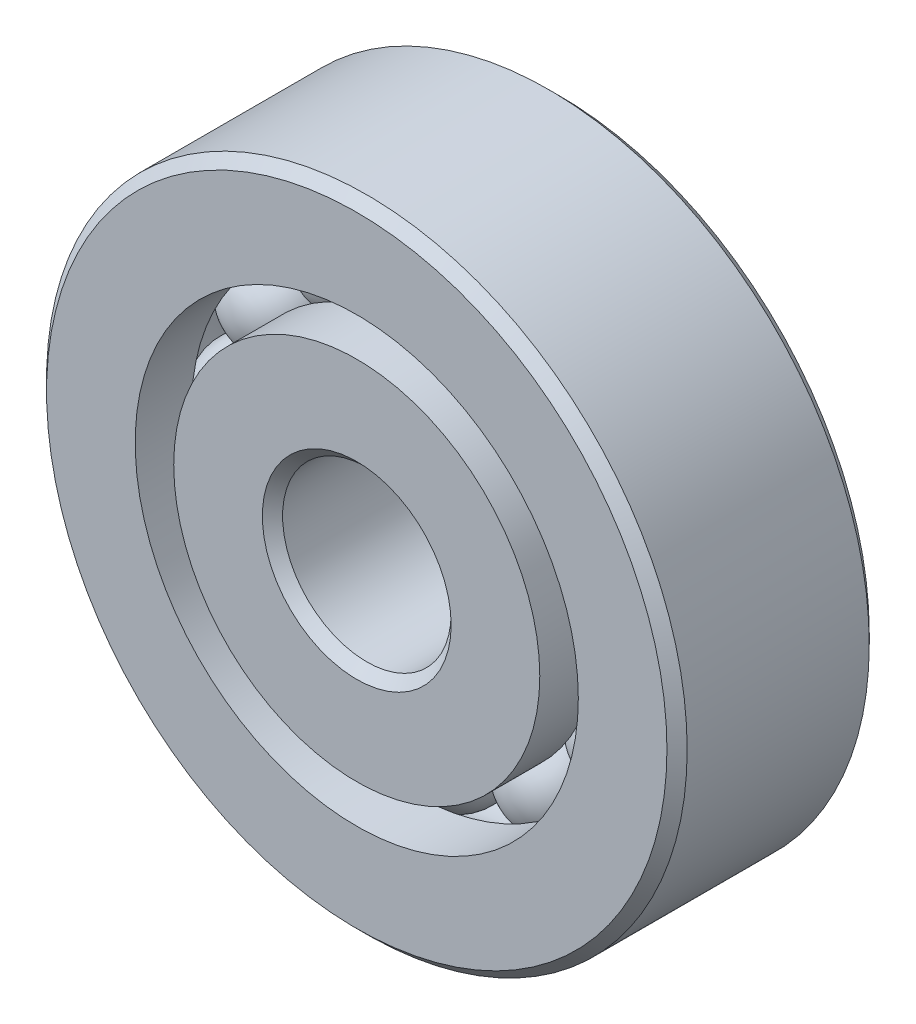
ISO-10303-21;
HEADER;
FILE_DESCRIPTION(('STEP AP214'),'2;1');
FILE_NAME('part.step','',(''),(''),'','','');
FILE_SCHEMA(('AUTOMOTIVE_DESIGN { 1 0 10303 214 1 1 1 1 }'));
ENDSEC;
DATA;
#1=APPLICATION_CONTEXT('core data for automotive mechanical design processes');
#2=APPLICATION_PROTOCOL_DEFINITION('international standard','automotive_design',2000,#1);
#3=PRODUCT_CONTEXT('',#1,'mechanical');
#4=PRODUCT('Part','Part','',(#3));
#5=PRODUCT_RELATED_PRODUCT_CATEGORY('part','',(#4));
#6=PRODUCT_DEFINITION_FORMATION('','',#4);
#7=PRODUCT_DEFINITION_CONTEXT('part definition',#1,'design');
#8=PRODUCT_DEFINITION('design','',#6,#7);
#9=PRODUCT_DEFINITION_SHAPE('','',#8);
#10=(LENGTH_UNIT() NAMED_UNIT(*) SI_UNIT(.MILLI.,.METRE.));
#11=(NAMED_UNIT(*) PLANE_ANGLE_UNIT() SI_UNIT($,.RADIAN.));
#12=(NAMED_UNIT(*) SI_UNIT($,.STERADIAN.) SOLID_ANGLE_UNIT());
#13=UNCERTAINTY_MEASURE_WITH_UNIT(LENGTH_MEASURE(1.E-05),#10,'distance_accuracy_value','');
#14=(GEOMETRIC_REPRESENTATION_CONTEXT(3) GLOBAL_UNCERTAINTY_ASSIGNED_CONTEXT((#13)) GLOBAL_UNIT_ASSIGNED_CONTEXT((#10,
#11,#12)) REPRESENTATION_CONTEXT('',''));
#15=CARTESIAN_POINT('',(0.,0.,0.));
#16=DIRECTION('',(0.,0.,1.));
#17=DIRECTION('',(1.,0.,0.));
#18=AXIS2_PLACEMENT_3D('',#15,#16,#17);
#19=CARTESIAN_POINT('',(-2.99999999999993,5.19615242270667,0.));
#20=DIRECTION('',(0.,0.,1.));
#21=DIRECTION('',(-0.499999999999989,0.866025403784445,0.));
#22=AXIS2_PLACEMENT_3D('',#19,#20,#21);
#23=SPHERICAL_SURFACE('',#22,1.45062344873598);
#24=CARTESIAN_POINT('',(-2.99999999999993,5.19615242270667,1.45062344873598));
#25=VERTEX_POINT('',#24);
#26=VERTEX_LOOP('',#25);
#27=FACE_BOUND('',#26,.T.);
#28=ADVANCED_FACE('F42',(#27),#23,.T.);
#29=CLOSED_SHELL('',(#28));
#30=MANIFOLD_SOLID_BREP('B2',#29);
#31=CARTESIAN_POINT('',(-5.1961524227066,3.00000000000006,0.));
#32=DIRECTION('',(0.,0.,1.));
#33=DIRECTION('',(-0.866025403784433,0.50000000000001,0.));
#34=AXIS2_PLACEMENT_3D('',#31,#32,#33);
#35=SPHERICAL_SURFACE('',#34,1.45062344873598);
#36=CARTESIAN_POINT('',(-5.1961524227066,3.00000000000006,1.45062344873598));
#37=VERTEX_POINT('',#36);
#38=VERTEX_LOOP('',#37);
#39=FACE_BOUND('',#38,.T.);
#40=ADVANCED_FACE('F63',(#39),#35,.T.);
#41=CLOSED_SHELL('',(#40));
#42=MANIFOLD_SOLID_BREP('B6',#41);
#43=CARTESIAN_POINT('',(-6.,0.,0.));
#44=DIRECTION('',(0.,0.,1.));
#45=DIRECTION('',(-1.,0.,0.));
#46=AXIS2_PLACEMENT_3D('',#43,#44,#45);
#47=SPHERICAL_SURFACE('',#46,1.45062344873598);
#48=CARTESIAN_POINT('',(-6.,0.,1.45062344873598));
#49=VERTEX_POINT('',#48);
#50=VERTEX_LOOP('',#49);
#51=FACE_BOUND('',#50,.T.);
#52=ADVANCED_FACE('F84',(#51),#47,.T.);
#53=CLOSED_SHELL('',(#52));
#54=MANIFOLD_SOLID_BREP('B38',#53);
#55=CARTESIAN_POINT('',(-5.19615242270666,-2.99999999999995,0.));
#56=DIRECTION('',(0.,0.,1.));
#57=DIRECTION('',(-0.866025403784443,-0.499999999999992,0.));
#58=AXIS2_PLACEMENT_3D('',#55,#56,#57);
#59=SPHERICAL_SURFACE('',#58,1.45062344873598);
#60=CARTESIAN_POINT('',(-5.19615242270666,-2.99999999999995,1.45062344873598));
#61=VERTEX_POINT('',#60);
#62=VERTEX_LOOP('',#61);
#63=FACE_BOUND('',#62,.T.);
#64=ADVANCED_FACE('F105',(#63),#59,.T.);
#65=CLOSED_SHELL('',(#64));
#66=MANIFOLD_SOLID_BREP('B59',#65);
#67=CARTESIAN_POINT('',(-3.00000000000004,-5.19615242270661,0.));
#68=DIRECTION('',(0.,0.,1.));
#69=DIRECTION('',(-0.500000000000007,-0.866025403784435,0.));
#70=AXIS2_PLACEMENT_3D('',#67,#68,#69);
#71=SPHERICAL_SURFACE('',#70,1.45062344873598);
#72=CARTESIAN_POINT('',(-3.00000000000004,-5.19615242270661,1.45062344873598));
#73=VERTEX_POINT('',#72);
#74=VERTEX_LOOP('',#73);
#75=FACE_BOUND('',#74,.T.);
#76=ADVANCED_FACE('F126',(#75),#71,.T.);
#77=CLOSED_SHELL('',(#76));
#78=MANIFOLD_SOLID_BREP('B80',#77);
#79=CARTESIAN_POINT('',(0.,-6.,0.));
#80=DIRECTION('',(0.,0.,1.));
#81=DIRECTION('',(0.,-1.,0.));
#82=AXIS2_PLACEMENT_3D('',#79,#80,#81);
#83=SPHERICAL_SURFACE('',#82,1.45062344873598);
#84=CARTESIAN_POINT('',(0.,-6.,1.45062344873598));
#85=VERTEX_POINT('',#84);
#86=VERTEX_LOOP('',#85);
#87=FACE_BOUND('',#86,.T.);
#88=ADVANCED_FACE('F147',(#87),#83,.T.);
#89=CLOSED_SHELL('',(#88));
#90=MANIFOLD_SOLID_BREP('B101',#89);
#91=CARTESIAN_POINT('',(2.99999999999997,-5.19615242270665,0.));
#92=DIRECTION('',(0.,0.,1.));
#93=DIRECTION('',(0.499999999999995,-0.866025403784442,0.));
#94=AXIS2_PLACEMENT_3D('',#91,#92,#93);
#95=SPHERICAL_SURFACE('',#94,1.45062344873598);
#96=CARTESIAN_POINT('',(2.99999999999997,-5.19615242270665,1.45062344873598));
#97=VERTEX_POINT('',#96);
#98=VERTEX_LOOP('',#97);
#99=FACE_BOUND('',#98,.T.);
#100=ADVANCED_FACE('F168',(#99),#95,.T.);
#101=CLOSED_SHELL('',(#100));
#102=MANIFOLD_SOLID_BREP('B122',#101);
#103=CARTESIAN_POINT('',(5.19615242270662,-3.00000000000002,0.));
#104=DIRECTION('',(0.,0.,1.));
#105=DIRECTION('',(0.866025403784436,-0.500000000000004,0.));
#106=AXIS2_PLACEMENT_3D('',#103,#104,#105);
#107=SPHERICAL_SURFACE('',#106,1.45062344873598);
#108=CARTESIAN_POINT('',(5.19615242270662,-3.00000000000002,1.45062344873598));
#109=VERTEX_POINT('',#108);
#110=VERTEX_LOOP('',#109);
#111=FACE_BOUND('',#110,.T.);
#112=ADVANCED_FACE('F189',(#111),#107,.T.);
#113=CLOSED_SHELL('',(#112));
#114=MANIFOLD_SOLID_BREP('B143',#113);
#115=CARTESIAN_POINT('',(6.,0.,0.));
#116=DIRECTION('',(0.,0.,1.));
#117=DIRECTION('',(1.,0.,0.));
#118=AXIS2_PLACEMENT_3D('',#115,#116,#117);
#119=SPHERICAL_SURFACE('',#118,1.45062344873598);
#120=CARTESIAN_POINT('',(6.,0.,1.45062344873598));
#121=VERTEX_POINT('',#120);
#122=VERTEX_LOOP('',#121);
#123=FACE_BOUND('',#122,.T.);
#124=ADVANCED_FACE('F210',(#123),#119,.T.);
#125=CLOSED_SHELL('',(#124));
#126=MANIFOLD_SOLID_BREP('B164',#125);
#127=CARTESIAN_POINT('',(5.19615242270664,2.99999999999999,0.));
#128=DIRECTION('',(0.,0.,1.));
#129=DIRECTION('',(0.86602540378444,0.499999999999998,0.));
#130=AXIS2_PLACEMENT_3D('',#127,#128,#129);
#131=SPHERICAL_SURFACE('',#130,1.45062344873598);
#132=CARTESIAN_POINT('',(5.19615242270664,2.99999999999999,1.45062344873598));
#133=VERTEX_POINT('',#132);
#134=VERTEX_LOOP('',#133);
#135=FACE_BOUND('',#134,.T.);
#136=ADVANCED_FACE('F231',(#135),#131,.T.);
#137=CLOSED_SHELL('',(#136));
#138=MANIFOLD_SOLID_BREP('B185',#137);
#139=CARTESIAN_POINT('',(3.00000000000001,5.19615242270663,0.));
#140=DIRECTION('',(0.,0.,1.));
#141=DIRECTION('',(0.500000000000001,0.866025403784438,0.));
#142=AXIS2_PLACEMENT_3D('',#139,#140,#141);
#143=SPHERICAL_SURFACE('',#142,1.45062344873598);
#144=CARTESIAN_POINT('',(3.00000000000001,5.19615242270663,1.45062344873598));
#145=VERTEX_POINT('',#144);
#146=VERTEX_LOOP('',#145);
#147=FACE_BOUND('',#146,.T.);
#148=ADVANCED_FACE('F252',(#147),#143,.T.);
#149=CLOSED_SHELL('',(#148));
#150=MANIFOLD_SOLID_BREP('B206',#149);
#151=CARTESIAN_POINT('',(0.,6.,0.));
#152=DIRECTION('',(0.,0.,1.));
#153=DIRECTION('',(0.,1.,0.));
#154=AXIS2_PLACEMENT_3D('',#151,#152,#153);
#155=SPHERICAL_SURFACE('',#154,1.45062344873598);
#156=CARTESIAN_POINT('',(0.,6.,1.45062344873598));
#157=VERTEX_POINT('',#156);
#158=VERTEX_LOOP('',#157);
#159=FACE_BOUND('',#158,.T.);
#160=ADVANCED_FACE('F275',(#159),#155,.T.);
#161=CLOSED_SHELL('',(#160));
#162=MANIFOLD_SOLID_BREP('B227',#161);
#163=CARTESIAN_POINT('',(0.,5.42857142857143,3.));
#164=DIRECTION('',(0.,0.,-1.));
#165=DIRECTION('',(-1.,0.,0.));
#166=AXIS2_PLACEMENT_3D('',#163,#164,#165);
#167=PLANE('',#166);
#168=CARTESIAN_POINT('',(0.,0.,3.));
#169=DIRECTION('',(0.,0.,1.));
#170=DIRECTION('',(1.,0.,0.));
#171=AXIS2_PLACEMENT_3D('',#168,#169,#170);
#172=CIRCLE('',#171,2.8);
#173=CARTESIAN_POINT('',(2.8,0.,3.));
#174=VERTEX_POINT('',#173);
#175=EDGE_CURVE('E323',#174,#174,#172,.T.);
#176=ORIENTED_EDGE('',*,*,#175,.F.);
#177=EDGE_LOOP('',(#176));
#178=FACE_BOUND('',#177,.T.);
#179=CARTESIAN_POINT('',(0.,0.,3.));
#180=DIRECTION('',(0.,0.,1.));
#181=DIRECTION('',(1.,0.,0.));
#182=AXIS2_PLACEMENT_3D('',#179,#180,#181);
#183=CIRCLE('',#182,5.42857142857143);
#184=CARTESIAN_POINT('',(5.42857142857143,0.,3.));
#185=VERTEX_POINT('',#184);
#186=EDGE_CURVE('E274',#185,#185,#183,.T.);
#187=ORIENTED_EDGE('',*,*,#186,.T.);
#188=EDGE_LOOP('',(#187));
#189=FACE_BOUND('',#188,.T.);
#190=ADVANCED_FACE('F295',(#178,#189),#167,.F.);
#191=CARTESIAN_POINT('',(0.,0.,3.));
#192=DIRECTION('',(0.,0.,1.));
#193=DIRECTION('',(1.,0.,0.));
#194=AXIS2_PLACEMENT_3D('',#191,#192,#193);
#195=CYLINDRICAL_SURFACE('',#194,5.42857142857143);
#196=ORIENTED_EDGE('',*,*,#186,.F.);
#197=EDGE_LOOP('',(#196));
#198=FACE_BOUND('',#197,.T.);
#199=CARTESIAN_POINT('',(0.,0.,1.33333333333333));
#200=DIRECTION('',(0.,0.,1.));
#201=DIRECTION('',(1.,0.,0.));
#202=AXIS2_PLACEMENT_3D('',#199,#200,#201);
#203=CIRCLE('',#202,5.42857142857143);
#204=CARTESIAN_POINT('',(5.42857142857143,0.,1.33333333333333));
#205=VERTEX_POINT('',#204);
#206=EDGE_CURVE('E301',#205,#205,#203,.T.);
#207=ORIENTED_EDGE('',*,*,#206,.T.);
#208=EDGE_LOOP('',(#207));
#209=FACE_BOUND('',#208,.T.);
#210=ADVANCED_FACE('F330',(#198,#209),#195,.T.);
#211=CARTESIAN_POINT('',(0.,0.,0.));
#212=DIRECTION('',(0.,0.,1.));
#213=DIRECTION('',(1.,0.,0.));
#214=AXIS2_PLACEMENT_3D('',#211,#212,#213);
#215=TOROIDAL_SURFACE('',#214,5.99999999999999,1.45062344873598);
#216=ORIENTED_EDGE('',*,*,#206,.F.);
#217=EDGE_LOOP('',(#216));
#218=FACE_BOUND('',#217,.T.);
#219=CARTESIAN_POINT('',(0.,0.,-1.33333333333333));
#220=DIRECTION('',(0.,0.,1.));
#221=DIRECTION('',(1.,0.,0.));
#222=AXIS2_PLACEMENT_3D('',#219,#220,#221);
#223=CIRCLE('',#222,5.42857142857143);
#224=CARTESIAN_POINT('',(5.42857142857143,0.,-1.33333333333333));
#225=VERTEX_POINT('',#224);
#226=EDGE_CURVE('E305',#225,#225,#223,.T.);
#227=ORIENTED_EDGE('',*,*,#226,.T.);
#228=EDGE_LOOP('',(#227));
#229=FACE_BOUND('',#228,.T.);
#230=ADVANCED_FACE('F334',(#218,#229),#215,.F.);
#231=CARTESIAN_POINT('',(0.,0.,3.));
#232=DIRECTION('',(0.,0.,1.));
#233=DIRECTION('',(1.,0.,0.));
#234=AXIS2_PLACEMENT_3D('',#231,#232,#233);
#235=CYLINDRICAL_SURFACE('',#234,5.42857142857143);
#236=ORIENTED_EDGE('',*,*,#226,.F.);
#237=EDGE_LOOP('',(#236));
#238=FACE_BOUND('',#237,.T.);
#239=CARTESIAN_POINT('',(0.,0.,-3.));
#240=DIRECTION('',(0.,0.,1.));
#241=DIRECTION('',(1.,0.,0.));
#242=AXIS2_PLACEMENT_3D('',#239,#240,#241);
#243=CIRCLE('',#242,5.42857142857143);
#244=CARTESIAN_POINT('',(5.42857142857143,0.,-3.));
#245=VERTEX_POINT('',#244);
#246=EDGE_CURVE('E309',#245,#245,#243,.T.);
#247=ORIENTED_EDGE('',*,*,#246,.T.);
#248=EDGE_LOOP('',(#247));
#249=FACE_BOUND('',#248,.T.);
#250=ADVANCED_FACE('F339',(#238,#249),#235,.T.);
#251=CARTESIAN_POINT('',(0.,2.8,-3.));
#252=DIRECTION('',(0.,0.,1.));
#253=DIRECTION('',(1.,0.,0.));
#254=AXIS2_PLACEMENT_3D('',#251,#252,#253);
#255=PLANE('',#254);
#256=ORIENTED_EDGE('',*,*,#246,.F.);
#257=EDGE_LOOP('',(#256));
#258=FACE_BOUND('',#257,.T.);
#259=CARTESIAN_POINT('',(0.,0.,-3.));
#260=DIRECTION('',(0.,0.,1.));
#261=DIRECTION('',(1.,0.,0.));
#262=AXIS2_PLACEMENT_3D('',#259,#260,#261);
#263=CIRCLE('',#262,2.8);
#264=CARTESIAN_POINT('',(2.8,0.,-3.));
#265=VERTEX_POINT('',#264);
#266=EDGE_CURVE('E314',#265,#265,#263,.T.);
#267=ORIENTED_EDGE('',*,*,#266,.T.);
#268=EDGE_LOOP('',(#267));
#269=FACE_BOUND('',#268,.T.);
#270=ADVANCED_FACE('F345',(#258,#269),#255,.F.);
#271=CARTESIAN_POINT('',(0.,0.,-2.7));
#272=DIRECTION('',(0.,0.,-1.));
#273=DIRECTION('',(-1.,0.,0.));
#274=AXIS2_PLACEMENT_3D('',#271,#272,#273);
#275=CONICAL_SURFACE('',#274,2.5,0.785398163397451);
#276=ORIENTED_EDGE('',*,*,#266,.F.);
#277=EDGE_LOOP('',(#276));
#278=FACE_BOUND('',#277,.T.);
#279=CARTESIAN_POINT('',(0.,0.,-2.7));
#280=DIRECTION('',(0.,0.,1.));
#281=DIRECTION('',(1.,0.,0.));
#282=AXIS2_PLACEMENT_3D('',#279,#280,#281);
#283=CIRCLE('',#282,2.5);
#284=CARTESIAN_POINT('',(2.5,0.,-2.7));
#285=VERTEX_POINT('',#284);
#286=EDGE_CURVE('E317',#285,#285,#283,.T.);
#287=ORIENTED_EDGE('',*,*,#286,.T.);
#288=EDGE_LOOP('',(#287));
#289=FACE_BOUND('',#288,.T.);
#290=ADVANCED_FACE('F349',(#278,#289),#275,.F.);
#291=CARTESIAN_POINT('',(0.,0.,3.));
#292=DIRECTION('',(0.,0.,1.));
#293=DIRECTION('',(1.,0.,0.));
#294=AXIS2_PLACEMENT_3D('',#291,#292,#293);
#295=CYLINDRICAL_SURFACE('',#294,2.5);
#296=ORIENTED_EDGE('',*,*,#286,.F.);
#297=EDGE_LOOP('',(#296));
#298=FACE_BOUND('',#297,.T.);
#299=CARTESIAN_POINT('',(0.,0.,2.7));
#300=DIRECTION('',(0.,0.,1.));
#301=DIRECTION('',(1.,0.,0.));
#302=AXIS2_PLACEMENT_3D('',#299,#300,#301);
#303=CIRCLE('',#302,2.5);
#304=CARTESIAN_POINT('',(2.5,0.,2.7));
#305=VERTEX_POINT('',#304);
#306=EDGE_CURVE('E320',#305,#305,#303,.T.);
#307=ORIENTED_EDGE('',*,*,#306,.T.);
#308=EDGE_LOOP('',(#307));
#309=FACE_BOUND('',#308,.T.);
#310=ADVANCED_FACE('F353',(#298,#309),#295,.F.);
#311=CARTESIAN_POINT('',(0.,0.,3.));
#312=DIRECTION('',(0.,0.,1.));
#313=DIRECTION('',(1.,0.,0.));
#314=AXIS2_PLACEMENT_3D('',#311,#312,#313);
#315=CONICAL_SURFACE('',#314,2.8,0.785398163397441);
#316=ORIENTED_EDGE('',*,*,#306,.F.);
#317=EDGE_LOOP('',(#316));
#318=FACE_BOUND('',#317,.T.);
#319=ORIENTED_EDGE('',*,*,#175,.T.);
#320=EDGE_LOOP('',(#319));
#321=FACE_BOUND('',#320,.T.);
#322=ADVANCED_FACE('F327',(#318,#321),#315,.F.);
#323=CLOSED_SHELL('',(#190,#210,#230,#250,#270,#290,#310,#322));
#324=MANIFOLD_SOLID_BREP('B248',#323);
#325=CARTESIAN_POINT('',(0.,0.,2.7));
#326=DIRECTION('',(0.,0.,-1.));
#327=DIRECTION('',(-1.,0.,0.));
#328=AXIS2_PLACEMENT_3D('',#325,#326,#327);
#329=CONICAL_SURFACE('',#328,9.5,0.785398163397448);
#330=CARTESIAN_POINT('',(0.,0.,3.));
#331=DIRECTION('',(0.,0.,1.));
#332=DIRECTION('',(1.,0.,0.));
#333=AXIS2_PLACEMENT_3D('',#330,#331,#332);
#334=CIRCLE('',#333,9.2);
#335=CARTESIAN_POINT('',(9.2,0.,3.));
#336=VERTEX_POINT('',#335);
#337=EDGE_CURVE('E445',#336,#336,#334,.T.);
#338=ORIENTED_EDGE('',*,*,#337,.F.);
#339=EDGE_LOOP('',(#338));
#340=FACE_BOUND('',#339,.T.);
#341=CARTESIAN_POINT('',(0.,0.,2.7));
#342=DIRECTION('',(0.,0.,1.));
#343=DIRECTION('',(1.,0.,0.));
#344=AXIS2_PLACEMENT_3D('',#341,#342,#343);
#345=CIRCLE('',#344,9.5);
#346=CARTESIAN_POINT('',(9.5,0.,2.7));
#347=VERTEX_POINT('',#346);
#348=EDGE_CURVE('E294',#347,#347,#345,.T.);
#349=ORIENTED_EDGE('',*,*,#348,.T.);
#350=EDGE_LOOP('',(#349));
#351=FACE_BOUND('',#350,.T.);
#352=ADVANCED_FACE('F417',(#340,#351),#329,.T.);
#353=CARTESIAN_POINT('',(0.,0.,3.));
#354=DIRECTION('',(0.,0.,1.));
#355=DIRECTION('',(1.,0.,0.));
#356=AXIS2_PLACEMENT_3D('',#353,#354,#355);
#357=CYLINDRICAL_SURFACE('',#356,9.5);
#358=ORIENTED_EDGE('',*,*,#348,.F.);
#359=EDGE_LOOP('',(#358));
#360=FACE_BOUND('',#359,.T.);
#361=CARTESIAN_POINT('',(0.,0.,-2.7));
#362=DIRECTION('',(0.,0.,1.));
#363=DIRECTION('',(1.,0.,0.));
#364=AXIS2_PLACEMENT_3D('',#361,#362,#363);
#365=CIRCLE('',#364,9.5);
#366=CARTESIAN_POINT('',(9.5,0.,-2.7));
#367=VERTEX_POINT('',#366);
#368=EDGE_CURVE('E423',#367,#367,#365,.T.);
#369=ORIENTED_EDGE('',*,*,#368,.T.);
#370=EDGE_LOOP('',(#369));
#371=FACE_BOUND('',#370,.T.);
#372=ADVANCED_FACE('F452',(#360,#371),#357,.T.);
#373=CARTESIAN_POINT('',(0.,0.,-3.));
#374=DIRECTION('',(0.,0.,1.));
#375=DIRECTION('',(1.,0.,0.));
#376=AXIS2_PLACEMENT_3D('',#373,#374,#375);
#377=CONICAL_SURFACE('',#376,9.2,0.785398163397448);
#378=ORIENTED_EDGE('',*,*,#368,.F.);
#379=EDGE_LOOP('',(#378));
#380=FACE_BOUND('',#379,.T.);
#381=CARTESIAN_POINT('',(0.,0.,-3.));
#382=DIRECTION('',(0.,0.,1.));
#383=DIRECTION('',(1.,0.,0.));
#384=AXIS2_PLACEMENT_3D('',#381,#382,#383);
#385=CIRCLE('',#384,9.2);
#386=CARTESIAN_POINT('',(9.2,0.,-3.));
#387=VERTEX_POINT('',#386);
#388=EDGE_CURVE('E427',#387,#387,#385,.T.);
#389=ORIENTED_EDGE('',*,*,#388,.T.);
#390=EDGE_LOOP('',(#389));
#391=FACE_BOUND('',#390,.T.);
#392=ADVANCED_FACE('F456',(#380,#391),#377,.T.);
#393=CARTESIAN_POINT('',(0.,9.2,-3.));
#394=DIRECTION('',(0.,0.,1.));
#395=DIRECTION('',(1.,0.,0.));
#396=AXIS2_PLACEMENT_3D('',#393,#394,#395);
#397=PLANE('',#396);
#398=ORIENTED_EDGE('',*,*,#388,.F.);
#399=EDGE_LOOP('',(#398));
#400=FACE_BOUND('',#399,.T.);
#401=CARTESIAN_POINT('',(0.,0.,-3.));
#402=DIRECTION('',(0.,0.,1.));
#403=DIRECTION('',(1.,0.,0.));
#404=AXIS2_PLACEMENT_3D('',#401,#402,#403);
#405=CIRCLE('',#404,6.57142857142857);
#406=CARTESIAN_POINT('',(6.57142857142857,0.,-3.));
#407=VERTEX_POINT('',#406);
#408=EDGE_CURVE('E431',#407,#407,#405,.T.);
#409=ORIENTED_EDGE('',*,*,#408,.T.);
#410=EDGE_LOOP('',(#409));
#411=FACE_BOUND('',#410,.T.);
#412=ADVANCED_FACE('F461',(#400,#411),#397,.F.);
#413=CARTESIAN_POINT('',(0.,0.,3.));
#414=DIRECTION('',(0.,0.,1.));
#415=DIRECTION('',(1.,0.,0.));
#416=AXIS2_PLACEMENT_3D('',#413,#414,#415);
#417=CYLINDRICAL_SURFACE('',#416,6.57142857142857);
#418=ORIENTED_EDGE('',*,*,#408,.F.);
#419=EDGE_LOOP('',(#418));
#420=FACE_BOUND('',#419,.T.);
#421=CARTESIAN_POINT('',(0.,0.,-1.33333333333333));
#422=DIRECTION('',(0.,0.,1.));
#423=DIRECTION('',(1.,0.,0.));
#424=AXIS2_PLACEMENT_3D('',#421,#422,#423);
#425=CIRCLE('',#424,6.57142857142857);
#426=CARTESIAN_POINT('',(6.57142857142857,0.,-1.33333333333333));
#427=VERTEX_POINT('',#426);
#428=EDGE_CURVE('E436',#427,#427,#425,.T.);
#429=ORIENTED_EDGE('',*,*,#428,.T.);
#430=EDGE_LOOP('',(#429));
#431=FACE_BOUND('',#430,.T.);
#432=ADVANCED_FACE('F467',(#420,#431),#417,.F.);
#433=CARTESIAN_POINT('',(0.,0.,0.));
#434=DIRECTION('',(0.,0.,1.));
#435=DIRECTION('',(1.,0.,0.));
#436=AXIS2_PLACEMENT_3D('',#433,#434,#435);
#437=TOROIDAL_SURFACE('',#436,6.,1.45062344873598);
#438=ORIENTED_EDGE('',*,*,#428,.F.);
#439=EDGE_LOOP('',(#438));
#440=FACE_BOUND('',#439,.T.);
#441=CARTESIAN_POINT('',(0.,0.,1.33333333333333));
#442=DIRECTION('',(0.,0.,1.));
#443=DIRECTION('',(1.,0.,0.));
#444=AXIS2_PLACEMENT_3D('',#441,#442,#443);
#445=CIRCLE('',#444,6.57142857142857);
#446=CARTESIAN_POINT('',(6.57142857142857,0.,1.33333333333333));
#447=VERTEX_POINT('',#446);
#448=EDGE_CURVE('E439',#447,#447,#445,.T.);
#449=ORIENTED_EDGE('',*,*,#448,.T.);
#450=EDGE_LOOP('',(#449));
#451=FACE_BOUND('',#450,.T.);
#452=ADVANCED_FACE('F471',(#440,#451),#437,.F.);
#453=CARTESIAN_POINT('',(0.,0.,3.));
#454=DIRECTION('',(0.,0.,1.));
#455=DIRECTION('',(1.,0.,0.));
#456=AXIS2_PLACEMENT_3D('',#453,#454,#455);
#457=CYLINDRICAL_SURFACE('',#456,6.57142857142857);
#458=ORIENTED_EDGE('',*,*,#448,.F.);
#459=EDGE_LOOP('',(#458));
#460=FACE_BOUND('',#459,.T.);
#461=CARTESIAN_POINT('',(0.,0.,3.));
#462=DIRECTION('',(0.,0.,1.));
#463=DIRECTION('',(1.,0.,0.));
#464=AXIS2_PLACEMENT_3D('',#461,#462,#463);
#465=CIRCLE('',#464,6.57142857142857);
#466=CARTESIAN_POINT('',(6.57142857142857,0.,3.));
#467=VERTEX_POINT('',#466);
#468=EDGE_CURVE('E442',#467,#467,#465,.T.);
#469=ORIENTED_EDGE('',*,*,#468,.T.);
#470=EDGE_LOOP('',(#469));
#471=FACE_BOUND('',#470,.T.);
#472=ADVANCED_FACE('F475',(#460,#471),#457,.F.);
#473=CARTESIAN_POINT('',(0.,9.2,3.));
#474=DIRECTION('',(0.,0.,-1.));
#475=DIRECTION('',(-1.,0.,0.));
#476=AXIS2_PLACEMENT_3D('',#473,#474,#475);
#477=PLANE('',#476);
#478=ORIENTED_EDGE('',*,*,#468,.F.);
#479=EDGE_LOOP('',(#478));
#480=FACE_BOUND('',#479,.T.);
#481=ORIENTED_EDGE('',*,*,#337,.T.);
#482=EDGE_LOOP('',(#481));
#483=FACE_BOUND('',#482,.T.);
#484=ADVANCED_FACE('F449',(#480,#483),#477,.F.);
#485=CLOSED_SHELL('',(#352,#372,#392,#412,#432,#452,#472,#484));
#486=MANIFOLD_SOLID_BREP('B269',#485);
#487=ADVANCED_BREP_SHAPE_REPRESENTATION('',(#18,#30,#42,#54,#66,#78,#90,#102,#114,#126,#138,
#150,#162,#324,#486),#14);
#488=SHAPE_DEFINITION_REPRESENTATION(#9,#487);
ENDSEC;
END-ISO-10303-21;
